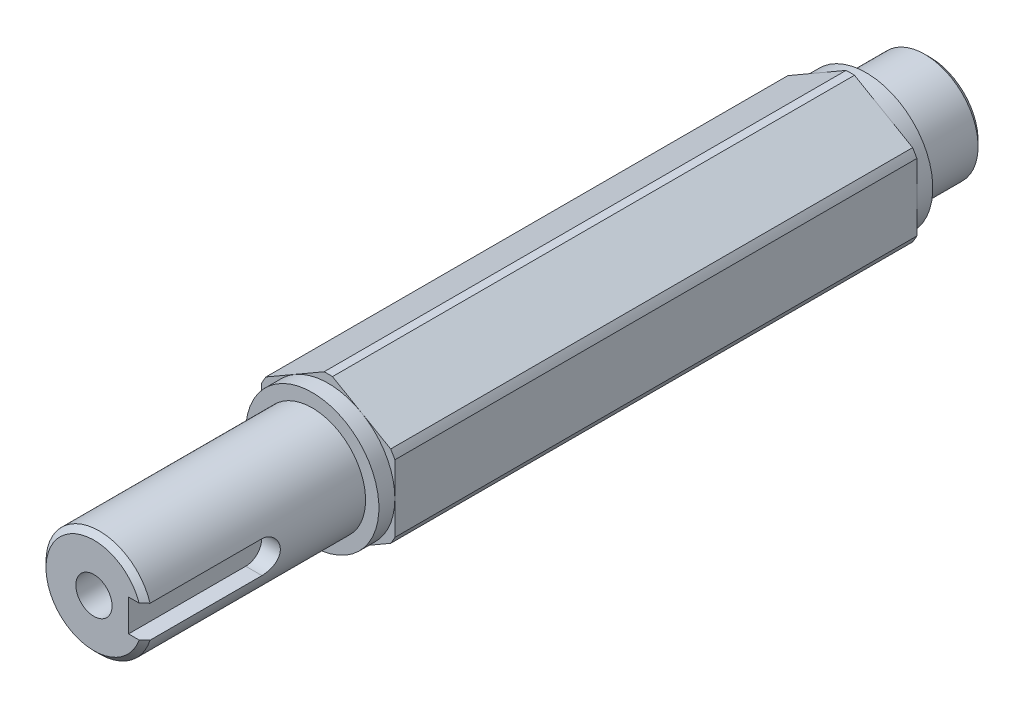
ISO-10303-21;
HEADER;
FILE_DESCRIPTION(('STEP AP214'),'2;1');
FILE_NAME('part.step','',(''),(''),'','','');
FILE_SCHEMA(('AUTOMOTIVE_DESIGN { 1 0 10303 214 1 1 1 1 }'));
ENDSEC;
DATA;
#1=APPLICATION_CONTEXT('core data for automotive mechanical design processes');
#2=APPLICATION_PROTOCOL_DEFINITION('international standard','automotive_design',2000,#1);
#3=PRODUCT_CONTEXT('',#1,'mechanical');
#4=PRODUCT('Part','Part','',(#3));
#5=PRODUCT_RELATED_PRODUCT_CATEGORY('part','',(#4));
#6=PRODUCT_DEFINITION_FORMATION('','',#4);
#7=PRODUCT_DEFINITION_CONTEXT('part definition',#1,'design');
#8=PRODUCT_DEFINITION('design','',#6,#7);
#9=PRODUCT_DEFINITION_SHAPE('','',#8);
#10=(LENGTH_UNIT() NAMED_UNIT(*) SI_UNIT(.MILLI.,.METRE.));
#11=(NAMED_UNIT(*) PLANE_ANGLE_UNIT() SI_UNIT($,.RADIAN.));
#12=(NAMED_UNIT(*) SI_UNIT($,.STERADIAN.) SOLID_ANGLE_UNIT());
#13=UNCERTAINTY_MEASURE_WITH_UNIT(LENGTH_MEASURE(1.E-05),#10,'distance_accuracy_value','');
#14=(GEOMETRIC_REPRESENTATION_CONTEXT(3) GLOBAL_UNCERTAINTY_ASSIGNED_CONTEXT((#13)) GLOBAL_UNIT_ASSIGNED_CONTEXT((#10,
#11,#12)) REPRESENTATION_CONTEXT('',''));
#15=CARTESIAN_POINT('',(0.,0.,0.));
#16=DIRECTION('',(0.,0.,1.));
#17=DIRECTION('',(1.,0.,0.));
#18=AXIS2_PLACEMENT_3D('',#15,#16,#17);
#19=CARTESIAN_POINT('',(0.,-30.9414213562373,-49.));
#20=DIRECTION('',(0.,0.,1.));
#21=DIRECTION('',(1.,0.,0.));
#22=AXIS2_PLACEMENT_3D('',#19,#20,#21);
#23=PLANE('',#22);
#24=CARTESIAN_POINT('',(0.,0.,-49.));
#25=DIRECTION('',(0.,0.,-1.));
#26=DIRECTION('',(-1.,0.,0.));
#27=AXIS2_PLACEMENT_3D('',#24,#25,#26);
#28=CIRCLE('',#27,12.5);
#29=CARTESIAN_POINT('',(-12.5,0.,-49.));
#30=VERTEX_POINT('',#29);
#31=CARTESIAN_POINT('',(-6.25,10.8253175473055,-49.));
#32=VERTEX_POINT('',#31);
#33=EDGE_CURVE('E250',#30,#32,#28,.T.);
#34=ORIENTED_EDGE('',*,*,#33,.F.);
#35=DIRECTION('',(0.,-1.,0.));
#36=VECTOR('',#35,1.);
#37=CARTESIAN_POINT('',(-12.5,-30.9414213562373,-49.));
#38=LINE('',#37,#36);
#39=CARTESIAN_POINT('',(-12.5,6.30476010645926,-49.));
#40=VERTEX_POINT('',#39);
#41=EDGE_CURVE('E317',#40,#30,#38,.T.);
#42=ORIENTED_EDGE('',*,*,#41,.F.);
#43=CARTESIAN_POINT('',(0.,0.,-49.));
#44=DIRECTION('',(0.,0.,1.));
#45=DIRECTION('',(1.,0.,0.));
#46=AXIS2_PLACEMENT_3D('',#43,#44,#45);
#47=CIRCLE('',#46,14.);
#48=CARTESIAN_POINT('',(-11.7100824169604,7.67293749407585,-49.));
#49=VERTEX_POINT('',#48);
#50=EDGE_CURVE('E315',#49,#40,#47,.T.);
#51=ORIENTED_EDGE('',*,*,#50,.F.);
#52=DIRECTION('',(-0.866025403784439,-0.5,0.));
#53=VECTOR('',#52,1.);
#54=CARTESIAN_POINT('',(-19.6480284618499,3.08996220824615,-49.));
#55=LINE('',#54,#53);
#56=EDGE_CURVE('E316',#32,#49,#55,.T.);
#57=ORIENTED_EDGE('',*,*,#56,.F.);
#58=EDGE_LOOP('',(#34,#42,#51,#57));
#59=FACE_BOUND('',#58,.T.);
#60=ADVANCED_FACE('F40',(#59),#23,.F.);
#61=CARTESIAN_POINT('',(6.24999999999999,10.8253175473055,-49.));
#62=VERTEX_POINT('',#61);
#63=EDGE_CURVE('E254',#32,#62,#28,.T.);
#64=ORIENTED_EDGE('',*,*,#63,.F.);
#65=CARTESIAN_POINT('',(-0.789917583039594,13.9776976005351,-49.));
#66=VERTEX_POINT('',#65);
#67=EDGE_CURVE('E312',#66,#32,#55,.T.);
#68=ORIENTED_EDGE('',*,*,#67,.F.);
#69=CARTESIAN_POINT('',(0.789917583039583,13.9776976005351,-49.));
#70=VERTEX_POINT('',#69);
#71=EDGE_CURVE('E308',#70,#66,#47,.T.);
#72=ORIENTED_EDGE('',*,*,#71,.F.);
#73=DIRECTION('',(-0.866025403784439,0.5,0.));
#74=VECTOR('',#73,1.);
#75=CARTESIAN_POINT('',(19.6480284618499,3.08996220824616,-49.));
#76=LINE('',#75,#74);
#77=EDGE_CURVE('E306',#62,#70,#76,.T.);
#78=ORIENTED_EDGE('',*,*,#77,.F.);
#79=EDGE_LOOP('',(#64,#68,#72,#78));
#80=FACE_BOUND('',#79,.T.);
#81=ADVANCED_FACE('F543',(#80),#23,.F.);
#82=CARTESIAN_POINT('',(12.5,0.,-49.));
#83=VERTEX_POINT('',#82);
#84=EDGE_CURVE('E64',#62,#83,#28,.T.);
#85=ORIENTED_EDGE('',*,*,#84,.F.);
#86=CARTESIAN_POINT('',(11.7100824169604,7.67293749407585,-49.));
#87=VERTEX_POINT('',#86);
#88=EDGE_CURVE('E309',#87,#62,#76,.T.);
#89=ORIENTED_EDGE('',*,*,#88,.F.);
#90=CARTESIAN_POINT('',(12.5,6.30476010645929,-49.));
#91=VERTEX_POINT('',#90);
#92=EDGE_CURVE('E304',#91,#87,#47,.T.);
#93=ORIENTED_EDGE('',*,*,#92,.F.);
#94=DIRECTION('',(0.,1.,0.));
#95=VECTOR('',#94,1.);
#96=CARTESIAN_POINT('',(12.5,-30.9414213562373,-49.));
#97=LINE('',#96,#95);
#98=EDGE_CURVE('E269',#83,#91,#97,.T.);
#99=ORIENTED_EDGE('',*,*,#98,.F.);
#100=EDGE_LOOP('',(#85,#89,#93,#99));
#101=FACE_BOUND('',#100,.T.);
#102=ADVANCED_FACE('F548',(#101),#23,.F.);
#103=CARTESIAN_POINT('',(6.25,-10.8253175473055,-49.));
#104=VERTEX_POINT('',#103);
#105=EDGE_CURVE('E497',#83,#104,#28,.T.);
#106=ORIENTED_EDGE('',*,*,#105,.F.);
#107=CARTESIAN_POINT('',(12.5,-6.30476010645927,-49.));
#108=VERTEX_POINT('',#107);
#109=EDGE_CURVE('E301',#108,#83,#97,.T.);
#110=ORIENTED_EDGE('',*,*,#109,.F.);
#111=CARTESIAN_POINT('',(11.7100824169604,-7.67293749407585,-49.));
#112=VERTEX_POINT('',#111);
#113=EDGE_CURVE('E307',#112,#108,#47,.T.);
#114=ORIENTED_EDGE('',*,*,#113,.F.);
#115=DIRECTION('',(0.866025403784439,0.5,0.));
#116=VECTOR('',#115,1.);
#117=CARTESIAN_POINT('',(-7.14802846184994,-18.5606728863648,-49.));
#118=LINE('',#117,#116);
#119=EDGE_CURVE('E329',#104,#112,#118,.T.);
#120=ORIENTED_EDGE('',*,*,#119,.F.);
#121=EDGE_LOOP('',(#106,#110,#114,#120));
#122=FACE_BOUND('',#121,.T.);
#123=ADVANCED_FACE('F546',(#122),#23,.F.);
#124=CARTESIAN_POINT('',(-6.24999999999999,-10.8253175473055,-49.));
#125=VERTEX_POINT('',#124);
#126=EDGE_CURVE('E493',#104,#125,#28,.T.);
#127=ORIENTED_EDGE('',*,*,#126,.F.);
#128=CARTESIAN_POINT('',(0.789917583039599,-13.9776976005351,-49.));
#129=VERTEX_POINT('',#128);
#130=EDGE_CURVE('E326',#129,#104,#118,.T.);
#131=ORIENTED_EDGE('',*,*,#130,.F.);
#132=CARTESIAN_POINT('',(-0.78991758303958,-13.9776976005351,-49.));
#133=VERTEX_POINT('',#132);
#134=EDGE_CURVE('E324',#133,#129,#47,.T.);
#135=ORIENTED_EDGE('',*,*,#134,.F.);
#136=DIRECTION('',(0.866025403784439,-0.5,0.));
#137=VECTOR('',#136,1.);
#138=CARTESIAN_POINT('',(7.14802846184994,-18.5606728863648,-49.));
#139=LINE('',#138,#137);
#140=EDGE_CURVE('E325',#125,#133,#139,.T.);
#141=ORIENTED_EDGE('',*,*,#140,.F.);
#142=EDGE_LOOP('',(#127,#131,#135,#141));
#143=FACE_BOUND('',#142,.T.);
#144=ADVANCED_FACE('F579',(#143),#23,.F.);
#145=EDGE_CURVE('E255',#125,#30,#28,.T.);
#146=ORIENTED_EDGE('',*,*,#145,.F.);
#147=CARTESIAN_POINT('',(-11.7100824169604,-7.67293749407585,-49.));
#148=VERTEX_POINT('',#147);
#149=EDGE_CURVE('E321',#148,#125,#139,.T.);
#150=ORIENTED_EDGE('',*,*,#149,.F.);
#151=CARTESIAN_POINT('',(-12.5,-6.30476010645927,-49.));
#152=VERTEX_POINT('',#151);
#153=EDGE_CURVE('E319',#152,#148,#47,.T.);
#154=ORIENTED_EDGE('',*,*,#153,.F.);
#155=EDGE_CURVE('E320',#30,#152,#38,.T.);
#156=ORIENTED_EDGE('',*,*,#155,.F.);
#157=EDGE_LOOP('',(#146,#150,#154,#156));
#158=FACE_BOUND('',#157,.T.);
#159=ADVANCED_FACE('F574',(#158),#23,.F.);
#160=CARTESIAN_POINT('',(0.,-30.9414213562373,49.));
#161=DIRECTION('',(0.,0.,1.));
#162=DIRECTION('',(1.,0.,0.));
#163=AXIS2_PLACEMENT_3D('',#160,#161,#162);
#164=PLANE('',#163);
#165=DIRECTION('',(0.,-1.,0.));
#166=VECTOR('',#165,1.);
#167=CARTESIAN_POINT('',(-12.5,-30.9414213562373,49.));
#168=LINE('',#167,#166);
#169=CARTESIAN_POINT('',(-12.5,6.30476010645926,49.));
#170=VERTEX_POINT('',#169);
#171=CARTESIAN_POINT('',(-12.5,0.,49.));
#172=VERTEX_POINT('',#171);
#173=EDGE_CURVE('E287',#170,#172,#168,.T.);
#174=ORIENTED_EDGE('',*,*,#173,.T.);
#175=CARTESIAN_POINT('',(0.,0.,49.));
#176=DIRECTION('',(0.,0.,-1.));
#177=DIRECTION('',(-1.,0.,0.));
#178=AXIS2_PLACEMENT_3D('',#175,#176,#177);
#179=CIRCLE('',#178,12.5);
#180=CARTESIAN_POINT('',(-6.24999999999999,10.8253175473055,49.));
#181=VERTEX_POINT('',#180);
#182=EDGE_CURVE('E258',#172,#181,#179,.T.);
#183=ORIENTED_EDGE('',*,*,#182,.T.);
#184=DIRECTION('',(-0.866025403784439,-0.5,0.));
#185=VECTOR('',#184,1.);
#186=CARTESIAN_POINT('',(-19.6480284618499,3.08996220824615,49.));
#187=LINE('',#186,#185);
#188=CARTESIAN_POINT('',(-11.7100824169604,7.67293749407585,49.));
#189=VERTEX_POINT('',#188);
#190=EDGE_CURVE('E286',#181,#189,#187,.T.);
#191=ORIENTED_EDGE('',*,*,#190,.T.);
#192=CARTESIAN_POINT('',(0.,0.,49.));
#193=DIRECTION('',(0.,0.,1.));
#194=DIRECTION('',(1.,0.,0.));
#195=AXIS2_PLACEMENT_3D('',#192,#193,#194);
#196=CIRCLE('',#195,14.);
#197=EDGE_CURVE('E285',#189,#170,#196,.T.);
#198=ORIENTED_EDGE('',*,*,#197,.T.);
#199=EDGE_LOOP('',(#174,#183,#191,#198));
#200=FACE_BOUND('',#199,.T.);
#201=ADVANCED_FACE('F476',(#200),#164,.T.);
#202=CARTESIAN_POINT('',(-0.789917583039594,13.9776976005351,49.));
#203=VERTEX_POINT('',#202);
#204=EDGE_CURVE('E282',#203,#181,#187,.T.);
#205=ORIENTED_EDGE('',*,*,#204,.T.);
#206=CARTESIAN_POINT('',(6.24999999999999,10.8253175473055,49.));
#207=VERTEX_POINT('',#206);
#208=EDGE_CURVE('E262',#181,#207,#179,.T.);
#209=ORIENTED_EDGE('',*,*,#208,.T.);
#210=DIRECTION('',(-0.866025403784439,0.5,0.));
#211=VECTOR('',#210,1.);
#212=CARTESIAN_POINT('',(19.6480284618499,3.08996220824616,49.));
#213=LINE('',#212,#211);
#214=CARTESIAN_POINT('',(0.789917583039583,13.9776976005351,49.));
#215=VERTEX_POINT('',#214);
#216=EDGE_CURVE('E276',#207,#215,#213,.T.);
#217=ORIENTED_EDGE('',*,*,#216,.T.);
#218=EDGE_CURVE('E278',#215,#203,#196,.T.);
#219=ORIENTED_EDGE('',*,*,#218,.T.);
#220=EDGE_LOOP('',(#205,#209,#217,#219));
#221=FACE_BOUND('',#220,.T.);
#222=ADVANCED_FACE('F558',(#221),#164,.T.);
#223=CARTESIAN_POINT('',(11.7100824169604,7.67293749407585,49.));
#224=VERTEX_POINT('',#223);
#225=EDGE_CURVE('E279',#224,#207,#213,.T.);
#226=ORIENTED_EDGE('',*,*,#225,.T.);
#227=CARTESIAN_POINT('',(12.5,0.,49.));
#228=VERTEX_POINT('',#227);
#229=EDGE_CURVE('E498',#207,#228,#179,.T.);
#230=ORIENTED_EDGE('',*,*,#229,.T.);
#231=DIRECTION('',(0.,1.,0.));
#232=VECTOR('',#231,1.);
#233=CARTESIAN_POINT('',(12.5,-30.9414213562373,49.));
#234=LINE('',#233,#232);
#235=CARTESIAN_POINT('',(12.5,6.30476010645929,49.));
#236=VERTEX_POINT('',#235);
#237=EDGE_CURVE('E274',#228,#236,#234,.T.);
#238=ORIENTED_EDGE('',*,*,#237,.T.);
#239=EDGE_CURVE('E273',#236,#224,#196,.T.);
#240=ORIENTED_EDGE('',*,*,#239,.T.);
#241=EDGE_LOOP('',(#226,#230,#238,#240));
#242=FACE_BOUND('',#241,.T.);
#243=ADVANCED_FACE('F553',(#242),#164,.T.);
#244=CARTESIAN_POINT('',(12.5,-6.30476010645927,49.));
#245=VERTEX_POINT('',#244);
#246=EDGE_CURVE('E270',#245,#228,#234,.T.);
#247=ORIENTED_EDGE('',*,*,#246,.T.);
#248=CARTESIAN_POINT('',(6.24999999999999,-10.8253175473055,49.));
#249=VERTEX_POINT('',#248);
#250=EDGE_CURVE('E502',#228,#249,#179,.T.);
#251=ORIENTED_EDGE('',*,*,#250,.T.);
#252=DIRECTION('',(0.866025403784439,0.5,0.));
#253=VECTOR('',#252,1.);
#254=CARTESIAN_POINT('',(-7.14802846184994,-18.5606728863648,49.));
#255=LINE('',#254,#253);
#256=CARTESIAN_POINT('',(11.7100824169604,-7.67293749407585,49.));
#257=VERTEX_POINT('',#256);
#258=EDGE_CURVE('E300',#249,#257,#255,.T.);
#259=ORIENTED_EDGE('',*,*,#258,.T.);
#260=EDGE_CURVE('E277',#257,#245,#196,.T.);
#261=ORIENTED_EDGE('',*,*,#260,.T.);
#262=EDGE_LOOP('',(#247,#251,#259,#261));
#263=FACE_BOUND('',#262,.T.);
#264=ADVANCED_FACE('F520',(#263),#164,.T.);
#265=CARTESIAN_POINT('',(0.789917583039599,-13.9776976005351,49.));
#266=VERTEX_POINT('',#265);
#267=EDGE_CURVE('E297',#266,#249,#255,.T.);
#268=ORIENTED_EDGE('',*,*,#267,.T.);
#269=CARTESIAN_POINT('',(-6.24999999999998,-10.8253175473055,49.));
#270=VERTEX_POINT('',#269);
#271=EDGE_CURVE('E471',#249,#270,#179,.T.);
#272=ORIENTED_EDGE('',*,*,#271,.T.);
#273=DIRECTION('',(0.866025403784439,-0.5,0.));
#274=VECTOR('',#273,1.);
#275=CARTESIAN_POINT('',(7.14802846184994,-18.5606728863648,49.));
#276=LINE('',#275,#274);
#277=CARTESIAN_POINT('',(-0.78991758303958,-13.9776976005351,49.));
#278=VERTEX_POINT('',#277);
#279=EDGE_CURVE('E296',#270,#278,#276,.T.);
#280=ORIENTED_EDGE('',*,*,#279,.T.);
#281=EDGE_CURVE('E295',#278,#266,#196,.T.);
#282=ORIENTED_EDGE('',*,*,#281,.T.);
#283=EDGE_LOOP('',(#268,#272,#280,#282));
#284=FACE_BOUND('',#283,.T.);
#285=ADVANCED_FACE('F510',(#284),#164,.T.);
#286=CARTESIAN_POINT('',(-11.7100824169604,-7.67293749407585,49.));
#287=VERTEX_POINT('',#286);
#288=EDGE_CURVE('E292',#287,#270,#276,.T.);
#289=ORIENTED_EDGE('',*,*,#288,.T.);
#290=EDGE_CURVE('E263',#270,#172,#179,.T.);
#291=ORIENTED_EDGE('',*,*,#290,.T.);
#292=CARTESIAN_POINT('',(-12.5,-6.30476010645927,49.));
#293=VERTEX_POINT('',#292);
#294=EDGE_CURVE('E291',#172,#293,#168,.T.);
#295=ORIENTED_EDGE('',*,*,#294,.T.);
#296=EDGE_CURVE('E290',#293,#287,#196,.T.);
#297=ORIENTED_EDGE('',*,*,#296,.T.);
#298=EDGE_LOOP('',(#289,#291,#295,#297));
#299=FACE_BOUND('',#298,.T.);
#300=ADVANCED_FACE('F468',(#299),#164,.T.);
#301=CARTESIAN_POINT('',(12.5,-30.9414213562373,49.));
#302=DIRECTION('',(-1.,0.,0.));
#303=DIRECTION('',(0.,-1.,0.));
#304=AXIS2_PLACEMENT_3D('',#301,#302,#303);
#305=PLANE('',#304);
#306=ORIENTED_EDGE('',*,*,#109,.T.);
#307=ORIENTED_EDGE('',*,*,#98,.T.);
#308=DIRECTION('',(0.,0.,-1.));
#309=VECTOR('',#308,1.);
#310=CARTESIAN_POINT('',(12.5,6.30476010645929,49.));
#311=LINE('',#310,#309);
#312=EDGE_CURVE('E363',#236,#91,#311,.T.);
#313=ORIENTED_EDGE('',*,*,#312,.F.);
#314=ORIENTED_EDGE('',*,*,#237,.F.);
#315=ORIENTED_EDGE('',*,*,#246,.F.);
#316=DIRECTION('',(0.,0.,-1.));
#317=VECTOR('',#316,1.);
#318=CARTESIAN_POINT('',(12.5,-6.30476010645927,49.));
#319=LINE('',#318,#317);
#320=EDGE_CURVE('E330',#245,#108,#319,.T.);
#321=ORIENTED_EDGE('',*,*,#320,.T.);
#322=EDGE_LOOP('',(#306,#307,#313,#314,#315,#321));
#323=FACE_BOUND('',#322,.T.);
#324=ADVANCED_FACE('F528',(#323),#305,.F.);
#325=CARTESIAN_POINT('',(0.,0.,49.));
#326=DIRECTION('',(0.,0.,-1.));
#327=DIRECTION('',(-1.,0.,0.));
#328=AXIS2_PLACEMENT_3D('',#325,#326,#327);
#329=CYLINDRICAL_SURFACE('',#328,14.);
#330=ORIENTED_EDGE('',*,*,#92,.T.);
#331=DIRECTION('',(0.,0.,-1.));
#332=VECTOR('',#331,1.);
#333=CARTESIAN_POINT('',(11.7100824169604,7.67293749407585,49.));
#334=LINE('',#333,#332);
#335=EDGE_CURVE('E360',#224,#87,#334,.T.);
#336=ORIENTED_EDGE('',*,*,#335,.F.);
#337=ORIENTED_EDGE('',*,*,#239,.F.);
#338=ORIENTED_EDGE('',*,*,#312,.T.);
#339=EDGE_LOOP('',(#330,#336,#337,#338));
#340=FACE_BOUND('',#339,.T.);
#341=ADVANCED_FACE('F551',(#340),#329,.T.);
#342=CARTESIAN_POINT('',(19.6480284618499,3.08996220824616,49.));
#343=DIRECTION('',(-0.5,-0.866025403784439,0.));
#344=DIRECTION('',(0.866025403784439,-0.5,0.));
#345=AXIS2_PLACEMENT_3D('',#342,#343,#344);
#346=PLANE('',#345);
#347=ORIENTED_EDGE('',*,*,#88,.T.);
#348=ORIENTED_EDGE('',*,*,#77,.T.);
#349=DIRECTION('',(0.,0.,-1.));
#350=VECTOR('',#349,1.);
#351=CARTESIAN_POINT('',(0.789917583039583,13.9776976005351,49.));
#352=LINE('',#351,#350);
#353=EDGE_CURVE('E357',#215,#70,#352,.T.);
#354=ORIENTED_EDGE('',*,*,#353,.F.);
#355=ORIENTED_EDGE('',*,*,#216,.F.);
#356=ORIENTED_EDGE('',*,*,#225,.F.);
#357=ORIENTED_EDGE('',*,*,#335,.T.);
#358=EDGE_LOOP('',(#347,#348,#354,#355,#356,#357));
#359=FACE_BOUND('',#358,.T.);
#360=ADVANCED_FACE('F555',(#359),#346,.F.);
#361=ORIENTED_EDGE('',*,*,#71,.T.);
#362=DIRECTION('',(0.,0.,-1.));
#363=VECTOR('',#362,1.);
#364=CARTESIAN_POINT('',(-0.789917583039594,13.9776976005351,49.));
#365=LINE('',#364,#363);
#366=EDGE_CURVE('E354',#203,#66,#365,.T.);
#367=ORIENTED_EDGE('',*,*,#366,.F.);
#368=ORIENTED_EDGE('',*,*,#218,.F.);
#369=ORIENTED_EDGE('',*,*,#353,.T.);
#370=EDGE_LOOP('',(#361,#367,#368,#369));
#371=FACE_BOUND('',#370,.T.);
#372=ADVANCED_FACE('F559',(#371),#329,.T.);
#373=CARTESIAN_POINT('',(-19.6480284618499,3.08996220824615,49.));
#374=DIRECTION('',(0.5,-0.866025403784438,0.));
#375=DIRECTION('',(0.866025403784439,0.5,0.));
#376=AXIS2_PLACEMENT_3D('',#373,#374,#375);
#377=PLANE('',#376);
#378=ORIENTED_EDGE('',*,*,#67,.T.);
#379=ORIENTED_EDGE('',*,*,#56,.T.);
#380=DIRECTION('',(0.,0.,-1.));
#381=VECTOR('',#380,1.);
#382=CARTESIAN_POINT('',(-11.7100824169604,7.67293749407585,49.));
#383=LINE('',#382,#381);
#384=EDGE_CURVE('E351',#189,#49,#383,.T.);
#385=ORIENTED_EDGE('',*,*,#384,.F.);
#386=ORIENTED_EDGE('',*,*,#190,.F.);
#387=ORIENTED_EDGE('',*,*,#204,.F.);
#388=ORIENTED_EDGE('',*,*,#366,.T.);
#389=EDGE_LOOP('',(#378,#379,#385,#386,#387,#388));
#390=FACE_BOUND('',#389,.T.);
#391=ADVANCED_FACE('F539',(#390),#377,.F.);
#392=ORIENTED_EDGE('',*,*,#50,.T.);
#393=DIRECTION('',(0.,0.,-1.));
#394=VECTOR('',#393,1.);
#395=CARTESIAN_POINT('',(-12.5,6.30476010645926,49.));
#396=LINE('',#395,#394);
#397=EDGE_CURVE('E348',#170,#40,#396,.T.);
#398=ORIENTED_EDGE('',*,*,#397,.F.);
#399=ORIENTED_EDGE('',*,*,#197,.F.);
#400=ORIENTED_EDGE('',*,*,#384,.T.);
#401=EDGE_LOOP('',(#392,#398,#399,#400));
#402=FACE_BOUND('',#401,.T.);
#403=ADVANCED_FACE('F481',(#402),#329,.T.);
#404=CARTESIAN_POINT('',(-12.5,-30.9414213562373,49.));
#405=DIRECTION('',(1.,0.,0.));
#406=DIRECTION('',(0.,1.,0.));
#407=AXIS2_PLACEMENT_3D('',#404,#405,#406);
#408=PLANE('',#407);
#409=ORIENTED_EDGE('',*,*,#41,.T.);
#410=ORIENTED_EDGE('',*,*,#155,.T.);
#411=DIRECTION('',(0.,0.,-1.));
#412=VECTOR('',#411,1.);
#413=CARTESIAN_POINT('',(-12.5,-6.30476010645927,49.));
#414=LINE('',#413,#412);
#415=EDGE_CURVE('E345',#293,#152,#414,.T.);
#416=ORIENTED_EDGE('',*,*,#415,.F.);
#417=ORIENTED_EDGE('',*,*,#294,.F.);
#418=ORIENTED_EDGE('',*,*,#173,.F.);
#419=ORIENTED_EDGE('',*,*,#397,.T.);
#420=EDGE_LOOP('',(#409,#410,#416,#417,#418,#419));
#421=FACE_BOUND('',#420,.T.);
#422=ADVANCED_FACE('F474',(#421),#408,.F.);
#423=ORIENTED_EDGE('',*,*,#153,.T.);
#424=DIRECTION('',(0.,0.,-1.));
#425=VECTOR('',#424,1.);
#426=CARTESIAN_POINT('',(-11.7100824169604,-7.67293749407585,49.));
#427=LINE('',#426,#425);
#428=EDGE_CURVE('E342',#287,#148,#427,.T.);
#429=ORIENTED_EDGE('',*,*,#428,.F.);
#430=ORIENTED_EDGE('',*,*,#296,.F.);
#431=ORIENTED_EDGE('',*,*,#415,.T.);
#432=EDGE_LOOP('',(#423,#429,#430,#431));
#433=FACE_BOUND('',#432,.T.);
#434=ADVANCED_FACE('F571',(#433),#329,.T.);
#435=CARTESIAN_POINT('',(7.14802846184994,-18.5606728863648,49.));
#436=DIRECTION('',(0.499999999999999,0.866025403784439,0.));
#437=DIRECTION('',(-0.866025403784439,0.5,0.));
#438=AXIS2_PLACEMENT_3D('',#435,#436,#437);
#439=PLANE('',#438);
#440=ORIENTED_EDGE('',*,*,#149,.T.);
#441=ORIENTED_EDGE('',*,*,#140,.T.);
#442=DIRECTION('',(0.,0.,-1.));
#443=VECTOR('',#442,1.);
#444=CARTESIAN_POINT('',(-0.78991758303958,-13.9776976005351,49.));
#445=LINE('',#444,#443);
#446=EDGE_CURVE('E339',#278,#133,#445,.T.);
#447=ORIENTED_EDGE('',*,*,#446,.F.);
#448=ORIENTED_EDGE('',*,*,#279,.F.);
#449=ORIENTED_EDGE('',*,*,#288,.F.);
#450=ORIENTED_EDGE('',*,*,#428,.T.);
#451=EDGE_LOOP('',(#440,#441,#447,#448,#449,#450));
#452=FACE_BOUND('',#451,.T.);
#453=ADVANCED_FACE('F514',(#452),#439,.F.);
#454=ORIENTED_EDGE('',*,*,#134,.T.);
#455=DIRECTION('',(0.,0.,-1.));
#456=VECTOR('',#455,1.);
#457=CARTESIAN_POINT('',(0.789917583039599,-13.9776976005351,49.));
#458=LINE('',#457,#456);
#459=EDGE_CURVE('E336',#266,#129,#458,.T.);
#460=ORIENTED_EDGE('',*,*,#459,.F.);
#461=ORIENTED_EDGE('',*,*,#281,.F.);
#462=ORIENTED_EDGE('',*,*,#446,.T.);
#463=EDGE_LOOP('',(#454,#460,#461,#462));
#464=FACE_BOUND('',#463,.T.);
#465=ADVANCED_FACE('F590',(#464),#329,.T.);
#466=CARTESIAN_POINT('',(-7.14802846184994,-18.5606728863648,49.));
#467=DIRECTION('',(-0.5,0.866025403784438,0.));
#468=DIRECTION('',(-0.866025403784439,-0.5,0.));
#469=AXIS2_PLACEMENT_3D('',#466,#467,#468);
#470=PLANE('',#469);
#471=ORIENTED_EDGE('',*,*,#130,.T.);
#472=ORIENTED_EDGE('',*,*,#119,.T.);
#473=DIRECTION('',(0.,0.,-1.));
#474=VECTOR('',#473,1.);
#475=CARTESIAN_POINT('',(11.7100824169604,-7.67293749407585,49.));
#476=LINE('',#475,#474);
#477=EDGE_CURVE('E333',#257,#112,#476,.T.);
#478=ORIENTED_EDGE('',*,*,#477,.F.);
#479=ORIENTED_EDGE('',*,*,#258,.F.);
#480=ORIENTED_EDGE('',*,*,#267,.F.);
#481=ORIENTED_EDGE('',*,*,#459,.T.);
#482=EDGE_LOOP('',(#471,#472,#478,#479,#480,#481));
#483=FACE_BOUND('',#482,.T.);
#484=ADVANCED_FACE('F598',(#483),#470,.F.);
#485=ORIENTED_EDGE('',*,*,#113,.T.);
#486=ORIENTED_EDGE('',*,*,#320,.F.);
#487=ORIENTED_EDGE('',*,*,#260,.F.);
#488=ORIENTED_EDGE('',*,*,#477,.T.);
#489=EDGE_LOOP('',(#485,#486,#487,#488));
#490=FACE_BOUND('',#489,.T.);
#491=ADVANCED_FACE('F524',(#490),#329,.T.);
#492=CARTESIAN_POINT('',(0.,0.,93.));
#493=DIRECTION('',(0.,0.,1.));
#494=DIRECTION('',(1.,0.,0.));
#495=AXIS2_PLACEMENT_3D('',#492,#493,#494);
#496=PLANE('',#495);
#497=DIRECTION('',(1.,0.,0.));
#498=VECTOR('',#497,1.);
#499=CARTESIAN_POINT('',(6.5,3.,93.));
#500=LINE('',#499,#498);
#501=CARTESIAN_POINT('',(6.5,3.,93.));
#502=VERTEX_POINT('',#501);
#503=CARTESIAN_POINT('',(8.48528137423858,3.,93.));
#504=VERTEX_POINT('',#503);
#505=EDGE_CURVE('E233',#502,#504,#500,.T.);
#506=ORIENTED_EDGE('',*,*,#505,.T.);
#507=CARTESIAN_POINT('',(0.,0.,93.));
#508=DIRECTION('',(0.,0.,1.));
#509=DIRECTION('',(1.,0.,0.));
#510=AXIS2_PLACEMENT_3D('',#507,#508,#509);
#511=CIRCLE('',#510,9.00000000000001);
#512=CARTESIAN_POINT('',(8.48528137423858,-3.,93.));
#513=VERTEX_POINT('',#512);
#514=EDGE_CURVE('E223',#504,#513,#511,.T.);
#515=ORIENTED_EDGE('',*,*,#514,.T.);
#516=DIRECTION('',(1.,0.,0.));
#517=VECTOR('',#516,1.);
#518=CARTESIAN_POINT('',(6.5,-3.,93.));
#519=LINE('',#518,#517);
#520=CARTESIAN_POINT('',(6.5,-3.,93.));
#521=VERTEX_POINT('',#520);
#522=EDGE_CURVE('E56',#521,#513,#519,.T.);
#523=ORIENTED_EDGE('',*,*,#522,.F.);
#524=DIRECTION('',(0.,-1.,0.));
#525=VECTOR('',#524,1.);
#526=CARTESIAN_POINT('',(6.5,0.,93.));
#527=LINE('',#526,#525);
#528=EDGE_CURVE('E11',#502,#521,#527,.T.);
#529=ORIENTED_EDGE('',*,*,#528,.F.);
#530=EDGE_LOOP('',(#506,#515,#523,#529));
#531=FACE_BOUND('',#530,.T.);
#532=CARTESIAN_POINT('',(0.,0.,93.));
#533=DIRECTION('',(0.,0.,1.));
#534=DIRECTION('',(1.,0.,0.));
#535=AXIS2_PLACEMENT_3D('',#532,#533,#534);
#536=CIRCLE('',#535,3.4);
#537=CARTESIAN_POINT('',(3.4,0.,93.));
#538=VERTEX_POINT('',#537);
#539=EDGE_CURVE('E235',#538,#538,#536,.T.);
#540=ORIENTED_EDGE('',*,*,#539,.F.);
#541=EDGE_LOOP('',(#540));
#542=FACE_BOUND('',#541,.T.);
#543=ADVANCED_FACE('F220',(#531,#542),#496,.T.);
#544=CARTESIAN_POINT('',(0.,0.,-70.7525256221566));
#545=DIRECTION('',(0.,0.,-1.));
#546=DIRECTION('',(-1.,0.,0.));
#547=AXIS2_PLACEMENT_3D('',#544,#545,#546);
#548=CYLINDRICAL_SURFACE('',#547,10.);
#549=CARTESIAN_POINT('',(9.53939201416946,-3.,71.));
#550=CARTESIAN_POINT('',(9.53938054248207,-3.00001027845728,70.9176644791773));
#551=CARTESIAN_POINT('',(9.54045772064378,-2.99661062684472,70.8353355449368));
#552=CARTESIAN_POINT('',(9.54470412105986,-2.98307142899347,70.6713060472345));
#553=CARTESIAN_POINT('',(9.54787287296848,-2.97293339805418,70.5896053466756));
#554=CARTESIAN_POINT('',(9.55620668351003,-2.94603140625045,70.4276150843268));
#555=CARTESIAN_POINT('',(9.56136667250114,-2.92928426957737,70.347322475957));
#556=CARTESIAN_POINT('',(9.57351626651178,-2.88932853030395,70.1885241558658));
#557=CARTESIAN_POINT('',(9.58050591937828,-2.86611975872641,70.1100184909326));
#558=CARTESIAN_POINT('',(9.60391637654137,-2.78708584446024,69.8780506120099));
#559=CARTESIAN_POINT('',(9.62279007830391,-2.72181852542973,69.727931561167));
#560=CARTESIAN_POINT('',(9.66493213967819,-2.56815043531276,69.440773956021));
#561=CARTESIAN_POINT('',(9.68820254290641,-2.4797388992416,69.3037415292378));
#562=CARTESIAN_POINT('',(9.73733650515374,-2.27929879634443,69.0422770120522));
#563=CARTESIAN_POINT('',(9.76325505469874,-2.16666914746584,68.9183151259391));
#564=CARTESIAN_POINT('',(9.81429628475077,-1.92227736150433,68.6907263851612));
#565=CARTESIAN_POINT('',(9.8394188301941,-1.79051199848164,68.587102966139));
#566=CARTESIAN_POINT('',(9.88666477976534,-1.50821997465697,68.4010731349054));
#567=CARTESIAN_POINT('',(9.90871541546878,-1.35736167401015,68.3191498202174));
#568=CARTESIAN_POINT('',(9.94668940088144,-1.04324233568302,68.1820229959971));
#569=CARTESIAN_POINT('',(9.96261433032403,-0.87998450868798,68.1268125966321));
#570=CARTESIAN_POINT('',(9.98615279768398,-0.550649404820596,68.046240448209));
#571=CARTESIAN_POINT('',(9.99399098526792,-0.384786253016199,68.0200702964824));
#572=CARTESIAN_POINT('',(10.0012640407204,-0.0508471415689255,67.995765304854));
#573=CARTESIAN_POINT('',(10.0007004995012,0.117228393125341,67.9976251573218));
#574=CARTESIAN_POINT('',(9.99139205125586,0.445143199271827,68.0287858206915));
#575=CARTESIAN_POINT('',(9.98290831016512,0.605074290763031,68.0572106908081));
#576=CARTESIAN_POINT('',(9.95903027401822,0.917780104370317,68.1392632696255));
#577=CARTESIAN_POINT('',(9.94363561692558,1.07055445110879,68.1928922986827));
#578=CARTESIAN_POINT('',(9.90730429851782,1.36669563173912,68.3244244435247));
#579=CARTESIAN_POINT('',(9.88630511384915,1.50993201207612,68.4026032887761));
#580=CARTESIAN_POINT('',(9.84099249303646,1.781531059161,68.5807971800344));
#581=CARTESIAN_POINT('',(9.81667831471806,1.90989038323251,68.6808171189407));
#582=CARTESIAN_POINT('',(9.7662334714278,2.15330901082206,68.9043839761846));
#583=CARTESIAN_POINT('',(9.74006890899097,2.26766702955975,69.0286877275262));
#584=CARTESIAN_POINT('',(9.68968430229327,2.47413538985067,69.2949948468511));
#585=CARTESIAN_POINT('',(9.66546482675134,2.5662392402618,69.4370033607298));
#586=CARTESIAN_POINT('',(9.62154457591303,2.72632814481701,69.7365618568999));
#587=CARTESIAN_POINT('',(9.60189192491895,2.79406012682263,69.8942543591871));
#588=CARTESIAN_POINT('',(9.56991327306402,2.90171772009405,70.2194490079631));
#589=CARTESIAN_POINT('',(9.55757606951749,2.94168586436072,70.3869357214287));
#590=CARTESIAN_POINT('',(9.54628064650012,2.97802407180159,70.6299897781404));
#591=CARTESIAN_POINT('',(9.54370312550533,2.98626405978017,70.7037814683592));
#592=CARTESIAN_POINT('',(9.54025857223564,2.99724711229708,70.8517029581991));
#593=CARTESIAN_POINT('',(9.53938902493288,2.99999825936538,70.9258320993277));
#594=CARTESIAN_POINT('',(9.53939201416946,3.,71.));
#595=B_SPLINE_CURVE_WITH_KNOTS('',3,(#549,#550,#551,#552,#553,#554,#555,#556,#557,#558,#559,
#560,#561,#562,#563,#564,#565,#566,#567,#568,#569,#570,#571,#572,#573,#574,#575,#576,#577,#578,
#579,#580,#581,#582,#583,#584,#585,#586,#587,#588,#589,#590,#591,#592,#593,#594),.UNSPECIFIED.,
.F.,.F.,(4,2,2,2,2,2,2,2,2,2,2,2,2,2,2,2,2,2,2,2,2,2,4),(0.,0.246918142439488,0.493780777706094,
0.740019009623012,0.986263681482027,1.47813347402025,1.97023245590778,2.47635119822767,
2.98255536239033,3.49922810620071,4.01576751791673,4.51753600864764,5.01920948804101,
5.50490358251093,5.99062312360832,6.48200583350621,6.9734987373917,7.48389234847122,
7.99443465298715,8.51013494368214,9.02504345105574,9.24774267716778,9.47011372732391),.UNSPECIFIED.);
#596=CARTESIAN_POINT('',(9.53939201416946,-3.,71.));
#597=VERTEX_POINT('',#596);
#598=CARTESIAN_POINT('',(9.53939201416946,3.,71.));
#599=VERTEX_POINT('',#598);
#600=EDGE_CURVE('E49',#597,#599,#595,.T.);
#601=ORIENTED_EDGE('',*,*,#600,.F.);
#602=DIRECTION('',(0.,0.,-1.));
#603=VECTOR('',#602,1.);
#604=CARTESIAN_POINT('',(9.53939201416946,-3.,-70.7525256221566));
#605=LINE('',#604,#603);
#606=CARTESIAN_POINT('',(9.53939201416946,-3.,92.));
#607=VERTEX_POINT('',#606);
#608=EDGE_CURVE('E230',#607,#597,#605,.T.);
#609=ORIENTED_EDGE('',*,*,#608,.F.);
#610=CARTESIAN_POINT('',(0.,0.,92.));
#611=DIRECTION('',(0.,0.,1.));
#612=DIRECTION('',(1.,0.,0.));
#613=AXIS2_PLACEMENT_3D('',#610,#611,#612);
#614=CIRCLE('',#613,10.);
#615=CARTESIAN_POINT('',(9.53939201416946,3.,92.));
#616=VERTEX_POINT('',#615);
#617=EDGE_CURVE('E372',#607,#616,#614,.F.);
#618=ORIENTED_EDGE('',*,*,#617,.T.);
#619=DIRECTION('',(0.,0.,-1.));
#620=VECTOR('',#619,1.);
#621=CARTESIAN_POINT('',(9.53939201416946,3.,-70.7525256221566));
#622=LINE('',#621,#620);
#623=EDGE_CURVE('E232',#599,#616,#622,.F.);
#624=ORIENTED_EDGE('',*,*,#623,.F.);
#625=EDGE_LOOP('',(#601,#609,#618,#624));
#626=FACE_BOUND('',#625,.T.);
#627=CARTESIAN_POINT('',(0.,0.,52.));
#628=DIRECTION('',(0.,0.,-1.));
#629=DIRECTION('',(-1.,0.,0.));
#630=AXIS2_PLACEMENT_3D('',#627,#628,#629);
#631=CIRCLE('',#630,10.);
#632=CARTESIAN_POINT('',(-10.,0.,52.));
#633=VERTEX_POINT('',#632);
#634=EDGE_CURVE('E266',#633,#633,#631,.T.);
#635=ORIENTED_EDGE('',*,*,#634,.F.);
#636=EDGE_LOOP('',(#635));
#637=FACE_BOUND('',#636,.T.);
#638=ADVANCED_FACE('F436',(#626,#637),#548,.T.);
#639=CARTESIAN_POINT('',(0.,10.,52.));
#640=DIRECTION('',(0.,0.,1.));
#641=DIRECTION('',(1.,0.,0.));
#642=AXIS2_PLACEMENT_3D('',#639,#640,#641);
#643=PLANE('',#642);
#644=ORIENTED_EDGE('',*,*,#634,.T.);
#645=EDGE_LOOP('',(#644));
#646=FACE_BOUND('',#645,.T.);
#647=CARTESIAN_POINT('',(0.,0.,52.));
#648=DIRECTION('',(0.,0.,-1.));
#649=DIRECTION('',(-1.,0.,0.));
#650=AXIS2_PLACEMENT_3D('',#647,#648,#649);
#651=CIRCLE('',#650,12.5);
#652=CARTESIAN_POINT('',(-12.5,0.,52.));
#653=VERTEX_POINT('',#652);
#654=EDGE_CURVE('E261',#653,#653,#651,.T.);
#655=ORIENTED_EDGE('',*,*,#654,.F.);
#656=EDGE_LOOP('',(#655));
#657=FACE_BOUND('',#656,.T.);
#658=ADVANCED_FACE('F432',(#646,#657),#643,.T.);
#659=CARTESIAN_POINT('',(0.,0.,-70.7525256221566));
#660=DIRECTION('',(0.,0.,-1.));
#661=DIRECTION('',(-1.,0.,0.));
#662=AXIS2_PLACEMENT_3D('',#659,#660,#661);
#663=CYLINDRICAL_SURFACE('',#662,12.5);
#664=ORIENTED_EDGE('',*,*,#654,.T.);
#665=EDGE_LOOP('',(#664));
#666=FACE_BOUND('',#665,.T.);
#667=ORIENTED_EDGE('',*,*,#182,.F.);
#668=ORIENTED_EDGE('',*,*,#290,.F.);
#669=ORIENTED_EDGE('',*,*,#271,.F.);
#670=ORIENTED_EDGE('',*,*,#250,.F.);
#671=ORIENTED_EDGE('',*,*,#229,.F.);
#672=ORIENTED_EDGE('',*,*,#208,.F.);
#673=EDGE_LOOP('',(#667,#668,#669,#670,#671,#672));
#674=FACE_BOUND('',#673,.T.);
#675=ADVANCED_FACE('F428',(#666,#674),#663,.T.);
#676=CARTESIAN_POINT('',(0.,10.,-52.));
#677=DIRECTION('',(0.,0.,-1.));
#678=DIRECTION('',(-1.,0.,0.));
#679=AXIS2_PLACEMENT_3D('',#676,#677,#678);
#680=PLANE('',#679);
#681=CARTESIAN_POINT('',(0.,0.,-52.));
#682=DIRECTION('',(0.,0.,-1.));
#683=DIRECTION('',(-1.,0.,0.));
#684=AXIS2_PLACEMENT_3D('',#681,#682,#683);
#685=CIRCLE('',#684,12.5);
#686=CARTESIAN_POINT('',(-12.5,0.,-52.));
#687=VERTEX_POINT('',#686);
#688=EDGE_CURVE('E253',#687,#687,#685,.T.);
#689=ORIENTED_EDGE('',*,*,#688,.T.);
#690=EDGE_LOOP('',(#689));
#691=FACE_BOUND('',#690,.T.);
#692=CARTESIAN_POINT('',(0.,0.,-52.));
#693=DIRECTION('',(0.,0.,-1.));
#694=DIRECTION('',(-1.,0.,0.));
#695=AXIS2_PLACEMENT_3D('',#692,#693,#694);
#696=CIRCLE('',#695,10.);
#697=CARTESIAN_POINT('',(-10.,0.,-52.));
#698=VERTEX_POINT('',#697);
#699=EDGE_CURVE('E247',#698,#698,#696,.T.);
#700=ORIENTED_EDGE('',*,*,#699,.F.);
#701=EDGE_LOOP('',(#700));
#702=FACE_BOUND('',#701,.T.);
#703=ADVANCED_FACE('F424',(#691,#702),#680,.T.);
#704=CARTESIAN_POINT('',(0.,0.,-70.7525256221566));
#705=DIRECTION('',(0.,0.,-1.));
#706=DIRECTION('',(-1.,0.,0.));
#707=AXIS2_PLACEMENT_3D('',#704,#705,#706);
#708=CYLINDRICAL_SURFACE('',#707,12.5);
#709=ORIENTED_EDGE('',*,*,#33,.T.);
#710=ORIENTED_EDGE('',*,*,#63,.T.);
#711=ORIENTED_EDGE('',*,*,#84,.T.);
#712=ORIENTED_EDGE('',*,*,#105,.T.);
#713=ORIENTED_EDGE('',*,*,#126,.T.);
#714=ORIENTED_EDGE('',*,*,#145,.T.);
#715=EDGE_LOOP('',(#709,#710,#711,#712,#713,#714));
#716=FACE_BOUND('',#715,.T.);
#717=ORIENTED_EDGE('',*,*,#688,.F.);
#718=EDGE_LOOP('',(#717));
#719=FACE_BOUND('',#718,.T.);
#720=ADVANCED_FACE('F420',(#716,#719),#708,.T.);
#721=CARTESIAN_POINT('',(0.,10.,-64.));
#722=DIRECTION('',(0.,0.,-1.));
#723=DIRECTION('',(-1.,0.,0.));
#724=AXIS2_PLACEMENT_3D('',#721,#722,#723);
#725=PLANE('',#724);
#726=CARTESIAN_POINT('',(0.,0.,-64.));
#727=DIRECTION('',(0.,0.,-1.));
#728=DIRECTION('',(-1.,0.,0.));
#729=AXIS2_PLACEMENT_3D('',#726,#727,#728);
#730=CIRCLE('',#729,3.4);
#731=CARTESIAN_POINT('',(-3.4,0.,-64.));
#732=VERTEX_POINT('',#731);
#733=EDGE_CURVE('E241',#732,#732,#730,.T.);
#734=ORIENTED_EDGE('',*,*,#733,.F.);
#735=EDGE_LOOP('',(#734));
#736=FACE_BOUND('',#735,.T.);
#737=CARTESIAN_POINT('',(0.,0.,-64.));
#738=DIRECTION('',(0.,0.,-1.));
#739=DIRECTION('',(-1.,0.,0.));
#740=AXIS2_PLACEMENT_3D('',#737,#738,#739);
#741=CIRCLE('',#740,8.99999999999999);
#742=CARTESIAN_POINT('',(-8.99999999999999,0.,-64.));
#743=VERTEX_POINT('',#742);
#744=EDGE_CURVE('E366',#743,#743,#741,.T.);
#745=ORIENTED_EDGE('',*,*,#744,.T.);
#746=EDGE_LOOP('',(#745));
#747=FACE_BOUND('',#746,.T.);
#748=ADVANCED_FACE('F416',(#736,#747),#725,.T.);
#749=CARTESIAN_POINT('',(0.,0.,-70.7525256221566));
#750=DIRECTION('',(0.,0.,-1.));
#751=DIRECTION('',(-1.,0.,0.));
#752=AXIS2_PLACEMENT_3D('',#749,#750,#751);
#753=CYLINDRICAL_SURFACE('',#752,10.);
#754=CARTESIAN_POINT('',(0.,0.,-63.));
#755=DIRECTION('',(0.,0.,-1.));
#756=DIRECTION('',(-1.,0.,0.));
#757=AXIS2_PLACEMENT_3D('',#754,#755,#756);
#758=CIRCLE('',#757,10.);
#759=CARTESIAN_POINT('',(-10.,0.,-63.));
#760=VERTEX_POINT('',#759);
#761=EDGE_CURVE('E369',#760,#760,#758,.F.);
#762=ORIENTED_EDGE('',*,*,#761,.T.);
#763=EDGE_LOOP('',(#762));
#764=FACE_BOUND('',#763,.T.);
#765=ORIENTED_EDGE('',*,*,#699,.T.);
#766=EDGE_LOOP('',(#765));
#767=FACE_BOUND('',#766,.T.);
#768=ADVANCED_FACE('F412',(#764,#767),#753,.T.);
#769=CARTESIAN_POINT('',(0.,0.,-64.));
#770=DIRECTION('',(0.,0.,1.));
#771=DIRECTION('',(1.,0.,0.));
#772=AXIS2_PLACEMENT_3D('',#769,#770,#771);
#773=CONICAL_SURFACE('',#772,8.99999999999999,0.785398163397444);
#774=ORIENTED_EDGE('',*,*,#761,.F.);
#775=EDGE_LOOP('',(#774));
#776=FACE_BOUND('',#775,.T.);
#777=ORIENTED_EDGE('',*,*,#744,.F.);
#778=EDGE_LOOP('',(#777));
#779=FACE_BOUND('',#778,.T.);
#780=ADVANCED_FACE('F415',(#776,#779),#773,.T.);
#781=CARTESIAN_POINT('',(0.,0.,92.));
#782=DIRECTION('',(0.,0.,-1.));
#783=DIRECTION('',(-1.,0.,0.));
#784=AXIS2_PLACEMENT_3D('',#781,#782,#783);
#785=CONICAL_SURFACE('',#784,10.,0.785398163397458);
#786=CARTESIAN_POINT('',(13.862364610049,3.,87.8167298346983));
#787=CARTESIAN_POINT('',(13.4463655811899,3.,88.2232729465481));
#788=CARTESIAN_POINT('',(13.0299974215794,3.,88.6294404570925));
#789=CARTESIAN_POINT('',(12.1961980414051,3.,89.440635949321));
#790=CARTESIAN_POINT('',(11.7787668814269,3.,89.8456639932969));
#791=CARTESIAN_POINT('',(10.9426577388673,3.,90.6540565037942));
#792=CARTESIAN_POINT('',(10.5239803987704,3.,91.0574216344103));
#793=CARTESIAN_POINT('',(9.68460063654877,3.,91.8620957473304));
#794=CARTESIAN_POINT('',(9.26389808962641,3.,92.2634045996932));
#795=CARTESIAN_POINT('',(8.63051236353638,3.,92.8631956775232));
#796=CARTESIAN_POINT('',(8.41892227628644,3.,93.0628319983027));
#797=CARTESIAN_POINT('',(7.99483847885058,3.,93.4611403601836));
#798=CARTESIAN_POINT('',(7.7823447748537,3.,93.6598124078695));
#799=CARTESIAN_POINT('',(7.35626404056238,3.,94.0559167497974));
#800=CARTESIAN_POINT('',(7.142677180582,3.,94.2533492270961));
#801=CARTESIAN_POINT('',(6.71407178150625,3.,94.6466676008339));
#802=CARTESIAN_POINT('',(6.49905320476162,3.,94.8425534563035));
#803=CARTESIAN_POINT('',(6.06704198346988,3.,95.2324062109025));
#804=CARTESIAN_POINT('',(5.85004820970379,3.,95.426371860214));
#805=CARTESIAN_POINT('',(5.41364478168976,3.,95.8115444631132));
#806=CARTESIAN_POINT('',(5.19423530661444,3.,96.0027516189003));
#807=CARTESIAN_POINT('',(4.86258845351452,3.,96.2867234094265));
#808=CARTESIAN_POINT('',(4.75158767849999,3.,96.380932076461));
#809=CARTESIAN_POINT('',(4.52860955058791,3.,96.5681828635006));
#810=CARTESIAN_POINT('',(4.41663221911728,3.,96.661225008992));
#811=CARTESIAN_POINT('',(4.19149455440561,3.,96.8459275920017));
#812=CARTESIAN_POINT('',(4.0783339363872,3.,96.9375876833116));
#813=CARTESIAN_POINT('',(3.8506105300309,3.,97.1191653442129));
#814=CARTESIAN_POINT('',(3.7360476360494,3.,97.2090827811826));
#815=CARTESIAN_POINT('',(3.62066898491417,3.,97.2979532224445));
#816=B_SPLINE_CURVE_WITH_KNOTS('',3,(#786,#787,#788,#789,#790,#791,#792,#793,#794,#795,#796,
#797,#798,#799,#800,#801,#802,#803,#804,#805,#806,#807,#808,#809,#810,#811,#812,#813,#814,#815),
.UNSPECIFIED.,.F.,.F.,(4,2,2,2,2,2,2,2,2,2,2,2,2,2,4),(0.,1.74499272898794,3.48988813404754,
5.23400168832772,6.97822413070329,7.85093329252531,8.72363648658819,9.59620761845836,
10.468801787313,11.341930811869,12.2149955069316,12.6517591366854,13.0885132072719,
13.5253749266763,13.9622697631251),.UNSPECIFIED.);
#817=EDGE_CURVE('E383',#616,#504,#816,.T.);
#818=ORIENTED_EDGE('',*,*,#817,.F.);
#819=ORIENTED_EDGE('',*,*,#617,.F.);
#820=CARTESIAN_POINT('',(3.62066898491417,-3.,97.2979532224445));
#821=CARTESIAN_POINT('',(3.71187305171937,-3.,97.2277150227027));
#822=CARTESIAN_POINT('',(3.80256140609656,-3.,97.1568132288869));
#823=CARTESIAN_POINT('',(3.98303046233113,-3.,97.0138713960606));
#824=CARTESIAN_POINT('',(4.07281120542409,-3.,96.9418314091463));
#825=CARTESIAN_POINT('',(4.34095859264741,-3.,96.7243033600268));
#826=CARTESIAN_POINT('',(4.5181624149998,-3.,96.577382349735));
#827=CARTESIAN_POINT('',(4.87013194817699,-3.,96.2808013249015));
#828=CARTESIAN_POINT('',(5.04489859987208,-3.,96.1311424219806));
#829=CARTESIAN_POINT('',(5.39260027298458,-3.,95.8296971957491));
#830=CARTESIAN_POINT('',(5.565535199707,-3.,95.6779107633844));
#831=CARTESIAN_POINT('',(5.90984567194265,-3.,95.3727894044542));
#832=CARTESIAN_POINT('',(6.08122209214393,-3.,95.2194554633133));
#833=CARTESIAN_POINT('',(6.42280082659762,-3.,94.9114930495973));
#834=CARTESIAN_POINT('',(6.59300316148013,-3.,94.7568645998745));
#835=CARTESIAN_POINT('',(7.1022240252496,-3.,94.2913999821988));
#836=CARTESIAN_POINT('',(7.43982494737018,-3.,93.9790126119863));
#837=CARTESIAN_POINT('',(7.86525512205754,-3.,93.5820882712136));
#838=CARTESIAN_POINT('',(7.95429034946867,-3.,93.4988367295451));
#839=CARTESIAN_POINT('',(8.13219006750804,-3.,93.3321547898854));
#840=CARTESIAN_POINT('',(8.22105456156573,-3.,93.2487243955595));
#841=CARTESIAN_POINT('',(8.48743125246431,-3.,92.9981745289439));
#842=CARTESIAN_POINT('',(8.66471250909982,-3.,92.8308095833309));
#843=CARTESIAN_POINT('',(9.26404338440148,-3.,92.2632668140239));
#844=CARTESIAN_POINT('',(9.68489049552857,-3.,91.8618192251995));
#845=CARTESIAN_POINT('',(10.524587031598,-3.,91.0568387417032));
#846=CARTESIAN_POINT('',(10.9434364437065,-3.,90.6533058336694));
#847=CARTESIAN_POINT('',(11.7795731733632,-3.,89.8448821915885));
#848=CARTESIAN_POINT('',(12.1968609310421,-3.,89.4399919124806));
#849=CARTESIAN_POINT('',(13.0303436108618,-3.,88.6291028011464));
#850=CARTESIAN_POINT('',(13.4465385525977,-3.,88.2231039890669));
#851=CARTESIAN_POINT('',(13.862364610049,-3.,87.8167298346983));
#852=B_SPLINE_CURVE_WITH_KNOTS('',3,(#820,#821,#822,#823,#824,#825,#826,#827,#828,#829,#830,
#831,#832,#833,#834,#835,#836,#837,#838,#839,#840,#841,#842,#843,#844,#845,#846,#847,#848,#849,
#850,#851),.UNSPECIFIED.,.F.,.F.,(4,2,2,2,2,2,2,2,2,2,2,2,2,2,2,4),(0.,0.345337935668246,
0.690660110411695,1.38118287612184,2.07143124312021,2.76171512153143,3.45158415761935,
4.14144104084428,5.52128129022087,5.88696277994132,6.25263684592392,6.98404304931849,
8.72886642061458,10.47370098609,12.2179998285998,13.962267177899),.UNSPECIFIED.);
#853=EDGE_CURVE('E376',#513,#607,#852,.T.);
#854=ORIENTED_EDGE('',*,*,#853,.F.);
#855=ORIENTED_EDGE('',*,*,#514,.F.);
#856=EDGE_LOOP('',(#818,#819,#854,#855));
#857=FACE_BOUND('',#856,.T.);
#858=ADVANCED_FACE('F42',(#857),#785,.T.);
#859=CARTESIAN_POINT('',(0.,0.,-44.25));
#860=DIRECTION('',(0.,0.,-1.));
#861=DIRECTION('',(-1.,0.,0.));
#862=AXIS2_PLACEMENT_3D('',#859,#860,#861);
#863=CONICAL_SURFACE('',#862,3.4,1.02974425867665);
#864=CARTESIAN_POINT('',(0.,0.,-42.2070738953063));
#865=VERTEX_POINT('',#864);
#866=VERTEX_LOOP('',#865);
#867=FACE_BOUND('',#866,.T.);
#868=CARTESIAN_POINT('',(0.,0.,-44.25));
#869=DIRECTION('',(0.,0.,-1.));
#870=DIRECTION('',(-1.,0.,0.));
#871=AXIS2_PLACEMENT_3D('',#868,#869,#870);
#872=CIRCLE('',#871,3.4);
#873=CARTESIAN_POINT('',(-3.4,0.,-44.25));
#874=VERTEX_POINT('',#873);
#875=EDGE_CURVE('E244',#874,#874,#872,.T.);
#876=ORIENTED_EDGE('',*,*,#875,.T.);
#877=EDGE_LOOP('',(#876));
#878=FACE_BOUND('',#877,.T.);
#879=ADVANCED_FACE('F407',(#867,#878),#863,.F.);
#880=CARTESIAN_POINT('',(0.,0.,-64.));
#881=DIRECTION('',(0.,0.,-1.));
#882=DIRECTION('',(-1.,0.,0.));
#883=AXIS2_PLACEMENT_3D('',#880,#881,#882);
#884=CYLINDRICAL_SURFACE('',#883,3.4);
#885=ORIENTED_EDGE('',*,*,#875,.F.);
#886=EDGE_LOOP('',(#885));
#887=FACE_BOUND('',#886,.T.);
#888=ORIENTED_EDGE('',*,*,#733,.T.);
#889=EDGE_LOOP('',(#888));
#890=FACE_BOUND('',#889,.T.);
#891=ADVANCED_FACE('F403',(#887,#890),#884,.F.);
#892=CARTESIAN_POINT('',(0.,0.,73.25));
#893=DIRECTION('',(0.,0.,1.));
#894=DIRECTION('',(1.,0.,0.));
#895=AXIS2_PLACEMENT_3D('',#892,#893,#894);
#896=CONICAL_SURFACE('',#895,3.4,1.02974425867665);
#897=CARTESIAN_POINT('',(0.,0.,71.2070738953063));
#898=VERTEX_POINT('',#897);
#899=VERTEX_LOOP('',#898);
#900=FACE_BOUND('',#899,.T.);
#901=CARTESIAN_POINT('',(0.,0.,73.25));
#902=DIRECTION('',(0.,0.,1.));
#903=DIRECTION('',(1.,0.,0.));
#904=AXIS2_PLACEMENT_3D('',#901,#902,#903);
#905=CIRCLE('',#904,3.4);
#906=CARTESIAN_POINT('',(3.4,0.,73.25));
#907=VERTEX_POINT('',#906);
#908=EDGE_CURVE('E238',#907,#907,#905,.T.);
#909=ORIENTED_EDGE('',*,*,#908,.T.);
#910=EDGE_LOOP('',(#909));
#911=FACE_BOUND('',#910,.T.);
#912=ADVANCED_FACE('F399',(#900,#911),#896,.F.);
#913=CARTESIAN_POINT('',(0.,0.,93.));
#914=DIRECTION('',(0.,0.,1.));
#915=DIRECTION('',(1.,0.,0.));
#916=AXIS2_PLACEMENT_3D('',#913,#914,#915);
#917=CYLINDRICAL_SURFACE('',#916,3.4);
#918=ORIENTED_EDGE('',*,*,#908,.F.);
#919=EDGE_LOOP('',(#918));
#920=FACE_BOUND('',#919,.T.);
#921=ORIENTED_EDGE('',*,*,#539,.T.);
#922=EDGE_LOOP('',(#921));
#923=FACE_BOUND('',#922,.T.);
#924=ADVANCED_FACE('F395',(#920,#923),#917,.F.);
#925=CARTESIAN_POINT('',(6.5,3.,93.));
#926=DIRECTION('',(0.,1.,0.));
#927=DIRECTION('',(0.,0.,1.));
#928=AXIS2_PLACEMENT_3D('',#925,#926,#927);
#929=PLANE('',#928);
#930=ORIENTED_EDGE('',*,*,#623,.T.);
#931=ORIENTED_EDGE('',*,*,#817,.T.);
#932=ORIENTED_EDGE('',*,*,#505,.F.);
#933=DIRECTION('',(0.,0.,1.));
#934=VECTOR('',#933,1.);
#935=CARTESIAN_POINT('',(6.5,3.,93.));
#936=LINE('',#935,#934);
#937=CARTESIAN_POINT('',(6.5,3.,71.));
#938=VERTEX_POINT('',#937);
#939=EDGE_CURVE('E209',#938,#502,#936,.T.);
#940=ORIENTED_EDGE('',*,*,#939,.F.);
#941=DIRECTION('',(1.,0.,0.));
#942=VECTOR('',#941,1.);
#943=CARTESIAN_POINT('',(6.5,3.,71.));
#944=LINE('',#943,#942);
#945=EDGE_CURVE('E225',#938,#599,#944,.T.);
#946=ORIENTED_EDGE('',*,*,#945,.T.);
#947=EDGE_LOOP('',(#930,#931,#932,#940,#946));
#948=FACE_BOUND('',#947,.T.);
#949=ADVANCED_FACE('F398',(#948),#929,.F.);
#950=CARTESIAN_POINT('',(6.5,0.,71.));
#951=DIRECTION('',(1.,0.,0.));
#952=DIRECTION('',(0.,0.,-1.));
#953=AXIS2_PLACEMENT_3D('',#950,#951,#952);
#954=CYLINDRICAL_SURFACE('',#953,3.);
#955=DIRECTION('',(1.,0.,0.));
#956=VECTOR('',#955,1.);
#957=CARTESIAN_POINT('',(6.5,-3.,71.));
#958=LINE('',#957,#956);
#959=CARTESIAN_POINT('',(6.5,-3.,71.));
#960=VERTEX_POINT('',#959);
#961=EDGE_CURVE('E215',#960,#597,#958,.T.);
#962=ORIENTED_EDGE('',*,*,#961,.T.);
#963=ORIENTED_EDGE('',*,*,#600,.T.);
#964=ORIENTED_EDGE('',*,*,#945,.F.);
#965=CARTESIAN_POINT('',(6.5,0.,71.));
#966=DIRECTION('',(1.,0.,0.));
#967=DIRECTION('',(0.,0.,-1.));
#968=AXIS2_PLACEMENT_3D('',#965,#966,#967);
#969=CIRCLE('',#968,3.);
#970=EDGE_CURVE('E217',#960,#938,#969,.T.);
#971=ORIENTED_EDGE('',*,*,#970,.F.);
#972=EDGE_LOOP('',(#962,#963,#964,#971));
#973=FACE_BOUND('',#972,.T.);
#974=ADVANCED_FACE('F393',(#973),#954,.F.);
#975=CARTESIAN_POINT('',(6.5,-3.,93.));
#976=DIRECTION('',(0.,-1.,0.));
#977=DIRECTION('',(0.,0.,-1.));
#978=AXIS2_PLACEMENT_3D('',#975,#976,#977);
#979=PLANE('',#978);
#980=ORIENTED_EDGE('',*,*,#608,.T.);
#981=ORIENTED_EDGE('',*,*,#961,.F.);
#982=DIRECTION('',(0.,0.,-1.));
#983=VECTOR('',#982,1.);
#984=CARTESIAN_POINT('',(6.5,-3.,93.));
#985=LINE('',#984,#983);
#986=EDGE_CURVE('E207',#521,#960,#985,.T.);
#987=ORIENTED_EDGE('',*,*,#986,.F.);
#988=ORIENTED_EDGE('',*,*,#522,.T.);
#989=ORIENTED_EDGE('',*,*,#853,.T.);
#990=EDGE_LOOP('',(#980,#981,#987,#988,#989));
#991=FACE_BOUND('',#990,.T.);
#992=ADVANCED_FACE('F213',(#991),#979,.F.);
#993=CARTESIAN_POINT('',(6.5,0.,93.));
#994=DIRECTION('',(-1.,0.,0.));
#995=DIRECTION('',(0.,0.,1.));
#996=AXIS2_PLACEMENT_3D('',#993,#994,#995);
#997=PLANE('',#996);
#998=ORIENTED_EDGE('',*,*,#528,.T.);
#999=ORIENTED_EDGE('',*,*,#986,.T.);
#1000=ORIENTED_EDGE('',*,*,#970,.T.);
#1001=ORIENTED_EDGE('',*,*,#939,.T.);
#1002=EDGE_LOOP('',(#998,#999,#1000,#1001));
#1003=FACE_BOUND('',#1002,.T.);
#1004=ADVANCED_FACE('F205',(#1003),#997,.F.);
#1005=CLOSED_SHELL('',(#60,#81,#102,#123,#144,#159,#201,#222,#243,#264,#285,#300,#324,#341,#360,
#372,#391,#403,#422,#434,#453,#465,#484,#491,#543,#638,#658,#675,#703,#720,#748,#768,#780,#858,
#879,#891,#912,#924,#949,#974,#992,#1004));
#1006=MANIFOLD_SOLID_BREP('B2',#1005);
#1007=ADVANCED_BREP_SHAPE_REPRESENTATION('',(#18,#1006),#14);
#1008=SHAPE_DEFINITION_REPRESENTATION(#9,#1007);
ENDSEC;
END-ISO-10303-21;
